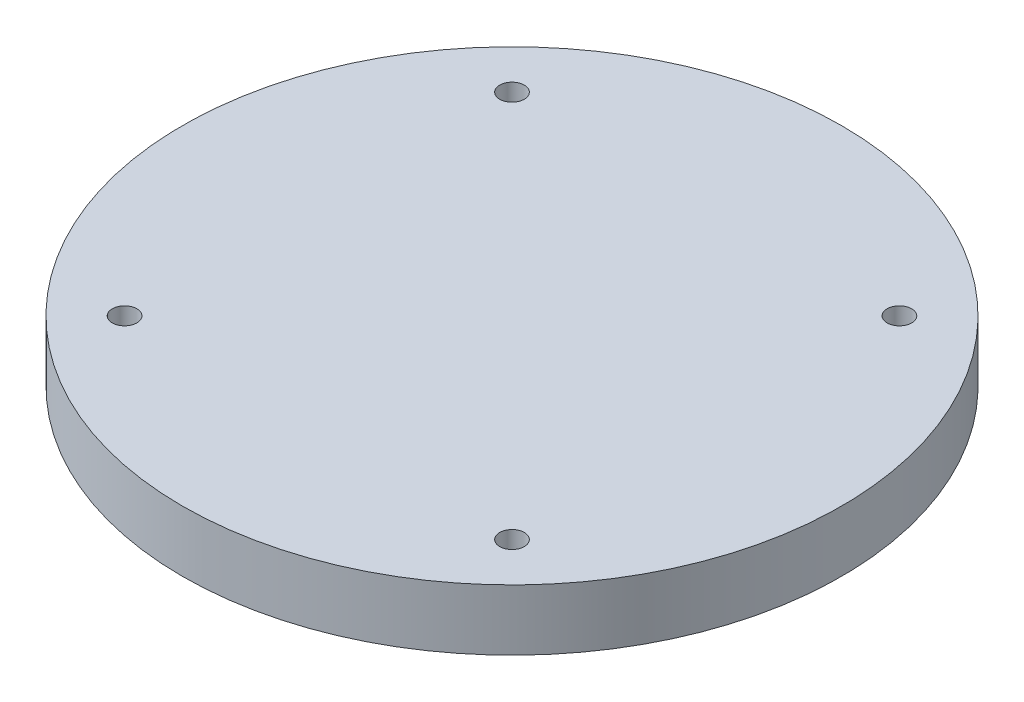
ISO-10303-21;
HEADER;
FILE_DESCRIPTION(('STEP AP214'),'2;1');
FILE_NAME('part.step','',(''),(''),'','','');
FILE_SCHEMA(('AUTOMOTIVE_DESIGN { 1 0 10303 214 1 1 1 1 }'));
ENDSEC;
DATA;
#1=APPLICATION_CONTEXT('core data for automotive mechanical design processes');
#2=APPLICATION_PROTOCOL_DEFINITION('international standard','automotive_design',2000,#1);
#3=PRODUCT_CONTEXT('',#1,'mechanical');
#4=PRODUCT('Part','Part','',(#3));
#5=PRODUCT_RELATED_PRODUCT_CATEGORY('part','',(#4));
#6=PRODUCT_DEFINITION_FORMATION('','',#4);
#7=PRODUCT_DEFINITION_CONTEXT('part definition',#1,'design');
#8=PRODUCT_DEFINITION('design','',#6,#7);
#9=PRODUCT_DEFINITION_SHAPE('','',#8);
#10=(LENGTH_UNIT() NAMED_UNIT(*) SI_UNIT(.MILLI.,.METRE.));
#11=(NAMED_UNIT(*) PLANE_ANGLE_UNIT() SI_UNIT($,.RADIAN.));
#12=(NAMED_UNIT(*) SI_UNIT($,.STERADIAN.) SOLID_ANGLE_UNIT());
#13=UNCERTAINTY_MEASURE_WITH_UNIT(LENGTH_MEASURE(1.E-05),#10,'distance_accuracy_value','');
#14=(GEOMETRIC_REPRESENTATION_CONTEXT(3) GLOBAL_UNCERTAINTY_ASSIGNED_CONTEXT((#13)) GLOBAL_UNIT_ASSIGNED_CONTEXT((#10,
#11,#12)) REPRESENTATION_CONTEXT('',''));
#15=CARTESIAN_POINT('',(0.,0.,0.));
#16=DIRECTION('',(0.,0.,1.));
#17=DIRECTION('',(1.,0.,0.));
#18=AXIS2_PLACEMENT_3D('',#15,#16,#17);
#19=CARTESIAN_POINT('',(0.,5.08,0.));
#20=DIRECTION('',(0.,-1.,0.));
#21=DIRECTION('',(0.,0.,-1.));
#22=AXIS2_PLACEMENT_3D('',#19,#20,#21);
#23=CYLINDRICAL_SURFACE('',#22,27.5);
#24=CARTESIAN_POINT('',(0.,5.08,0.));
#25=DIRECTION('',(0.,1.,0.));
#26=DIRECTION('',(0.,0.,1.));
#27=AXIS2_PLACEMENT_3D('',#24,#25,#26);
#28=CIRCLE('',#27,27.5);
#29=CARTESIAN_POINT('',(0.,5.08,27.5));
#30=VERTEX_POINT('',#29);
#31=EDGE_CURVE('E10',#30,#30,#28,.T.);
#32=ORIENTED_EDGE('',*,*,#31,.F.);
#33=EDGE_LOOP('',(#32));
#34=FACE_BOUND('',#33,.T.);
#35=CARTESIAN_POINT('',(0.,0.,0.));
#36=DIRECTION('',(0.,1.,0.));
#37=DIRECTION('',(0.,0.,1.));
#38=AXIS2_PLACEMENT_3D('',#35,#36,#37);
#39=CIRCLE('',#38,27.5);
#40=CARTESIAN_POINT('',(0.,0.,27.5));
#41=VERTEX_POINT('',#40);
#42=EDGE_CURVE('E34',#41,#41,#39,.T.);
#43=ORIENTED_EDGE('',*,*,#42,.T.);
#44=EDGE_LOOP('',(#43));
#45=FACE_BOUND('',#44,.T.);
#46=ADVANCED_FACE('F31',(#34,#45),#23,.T.);
#47=CARTESIAN_POINT('',(0.,5.08,0.));
#48=DIRECTION('',(0.,1.,0.));
#49=DIRECTION('',(0.,0.,1.));
#50=AXIS2_PLACEMENT_3D('',#47,#48,#49);
#51=PLANE('',#50);
#52=CARTESIAN_POINT('',(16.1644610179254,5.08,16.1644610179245));
#53=DIRECTION('',(0.,1.,0.));
#54=DIRECTION('',(0.,0.,1.));
#55=AXIS2_PLACEMENT_3D('',#52,#53,#54);
#56=CIRCLE('',#55,1.02499999999977);
#57=CARTESIAN_POINT('',(16.1644610179254,5.08,17.1894610179242));
#58=VERTEX_POINT('',#57);
#59=EDGE_CURVE('E56',#58,#58,#56,.T.);
#60=ORIENTED_EDGE('',*,*,#59,.F.);
#61=EDGE_LOOP('',(#60));
#62=FACE_BOUND('',#61,.T.);
#63=CARTESIAN_POINT('',(-16.1644610179245,5.08,-16.1644610179236));
#64=DIRECTION('',(0.,1.,0.));
#65=DIRECTION('',(0.,0.,1.));
#66=AXIS2_PLACEMENT_3D('',#63,#64,#65);
#67=CIRCLE('',#66,1.02500000000097);
#68=CARTESIAN_POINT('',(-16.1644610179245,5.08,-15.1394610179226));
#69=VERTEX_POINT('',#68);
#70=EDGE_CURVE('E49',#69,#69,#67,.T.);
#71=ORIENTED_EDGE('',*,*,#70,.F.);
#72=EDGE_LOOP('',(#71));
#73=FACE_BOUND('',#72,.T.);
#74=CARTESIAN_POINT('',(16.1644610179245,5.08,-16.1644610179245));
#75=DIRECTION('',(0.,1.,0.));
#76=DIRECTION('',(0.,0.,1.));
#77=AXIS2_PLACEMENT_3D('',#74,#75,#76);
#78=CIRCLE('',#77,1.025);
#79=CARTESIAN_POINT('',(16.1644610179245,5.08,-15.1394610179245));
#80=VERTEX_POINT('',#79);
#81=EDGE_CURVE('E61',#80,#80,#78,.T.);
#82=ORIENTED_EDGE('',*,*,#81,.F.);
#83=EDGE_LOOP('',(#82));
#84=FACE_BOUND('',#83,.T.);
#85=CARTESIAN_POINT('',(-16.1644610179236,5.08,16.1644610179254));
#86=DIRECTION('',(0.,1.,0.));
#87=DIRECTION('',(0.,0.,1.));
#88=AXIS2_PLACEMENT_3D('',#85,#86,#87);
#89=CIRCLE('',#88,1.02500000000068);
#90=CARTESIAN_POINT('',(-16.1644610179236,5.08,17.1894610179261));
#91=VERTEX_POINT('',#90);
#92=EDGE_CURVE('E43',#91,#91,#89,.T.);
#93=ORIENTED_EDGE('',*,*,#92,.F.);
#94=EDGE_LOOP('',(#93));
#95=FACE_BOUND('',#94,.T.);
#96=ORIENTED_EDGE('',*,*,#31,.T.);
#97=EDGE_LOOP('',(#96));
#98=FACE_BOUND('',#97,.T.);
#99=ADVANCED_FACE('F76',(#62,#73,#84,#95,#98),#51,.T.);
#100=CARTESIAN_POINT('',(0.,0.,0.));
#101=DIRECTION('',(0.,1.,0.));
#102=DIRECTION('',(0.,0.,1.));
#103=AXIS2_PLACEMENT_3D('',#100,#101,#102);
#104=PLANE('',#103);
#105=ORIENTED_EDGE('',*,*,#42,.F.);
#106=EDGE_LOOP('',(#105));
#107=FACE_BOUND('',#106,.T.);
#108=ADVANCED_FACE('F79',(#107),#104,.F.);
#109=CARTESIAN_POINT('',(-16.1644610179236,1.905,16.1644610179254));
#110=DIRECTION('',(0.,1.,0.));
#111=DIRECTION('',(0.,0.,1.));
#112=AXIS2_PLACEMENT_3D('',#109,#110,#111);
#113=CYLINDRICAL_SURFACE('',#112,1.02500000000068);
#114=CARTESIAN_POINT('',(-16.1644610179236,1.905,16.1644610179254));
#115=DIRECTION('',(0.,1.,0.));
#116=DIRECTION('',(0.,0.,1.));
#117=AXIS2_PLACEMENT_3D('',#114,#115,#116);
#118=CIRCLE('',#117,1.02500000000068);
#119=CARTESIAN_POINT('',(-16.1644610179236,1.905,17.1894610179261));
#120=VERTEX_POINT('',#119);
#121=EDGE_CURVE('E41',#120,#120,#118,.T.);
#122=ORIENTED_EDGE('',*,*,#121,.F.);
#123=EDGE_LOOP('',(#122));
#124=FACE_BOUND('',#123,.T.);
#125=ORIENTED_EDGE('',*,*,#92,.T.);
#126=EDGE_LOOP('',(#125));
#127=FACE_BOUND('',#126,.T.);
#128=ADVANCED_FACE('F84',(#124,#127),#113,.F.);
#129=CARTESIAN_POINT('',(0.,1.905,0.));
#130=DIRECTION('',(0.,1.,0.));
#131=DIRECTION('',(0.,0.,1.));
#132=AXIS2_PLACEMENT_3D('',#129,#130,#131);
#133=PLANE('',#132);
#134=ORIENTED_EDGE('',*,*,#121,.T.);
#135=EDGE_LOOP('',(#134));
#136=FACE_BOUND('',#135,.T.);
#137=ADVANCED_FACE('F72',(#136),#133,.T.);
#138=CARTESIAN_POINT('',(16.1644610179245,1.905,-16.1644610179245));
#139=DIRECTION('',(0.,1.,0.));
#140=DIRECTION('',(0.,0.,1.));
#141=AXIS2_PLACEMENT_3D('',#138,#139,#140);
#142=CYLINDRICAL_SURFACE('',#141,1.025);
#143=CARTESIAN_POINT('',(16.1644610179245,1.905,-16.1644610179245));
#144=DIRECTION('',(0.,1.,0.));
#145=DIRECTION('',(0.,0.,1.));
#146=AXIS2_PLACEMENT_3D('',#143,#144,#145);
#147=CIRCLE('',#146,1.025);
#148=CARTESIAN_POINT('',(16.1644610179245,1.905,-15.1394610179245));
#149=VERTEX_POINT('',#148);
#150=EDGE_CURVE('E53',#149,#149,#147,.T.);
#151=ORIENTED_EDGE('',*,*,#150,.F.);
#152=EDGE_LOOP('',(#151));
#153=FACE_BOUND('',#152,.T.);
#154=ORIENTED_EDGE('',*,*,#81,.T.);
#155=EDGE_LOOP('',(#154));
#156=FACE_BOUND('',#155,.T.);
#157=ADVANCED_FACE('F69',(#153,#156),#142,.F.);
#158=CARTESIAN_POINT('',(0.,1.905,0.));
#159=DIRECTION('',(0.,1.,0.));
#160=DIRECTION('',(0.,0.,1.));
#161=AXIS2_PLACEMENT_3D('',#158,#159,#160);
#162=PLANE('',#161);
#163=ORIENTED_EDGE('',*,*,#150,.T.);
#164=EDGE_LOOP('',(#163));
#165=FACE_BOUND('',#164,.T.);
#166=ADVANCED_FACE('F67',(#165),#162,.T.);
#167=CARTESIAN_POINT('',(-16.1644610179245,1.905,-16.1644610179236));
#168=DIRECTION('',(0.,1.,0.));
#169=DIRECTION('',(0.,0.,1.));
#170=AXIS2_PLACEMENT_3D('',#167,#168,#169);
#171=CYLINDRICAL_SURFACE('',#170,1.02500000000097);
#172=CARTESIAN_POINT('',(-16.1644610179245,1.905,-16.1644610179236));
#173=DIRECTION('',(0.,1.,0.));
#174=DIRECTION('',(0.,0.,1.));
#175=AXIS2_PLACEMENT_3D('',#172,#173,#174);
#176=CIRCLE('',#175,1.02500000000097);
#177=CARTESIAN_POINT('',(-16.1644610179245,1.905,-15.1394610179226));
#178=VERTEX_POINT('',#177);
#179=EDGE_CURVE('E52',#178,#178,#176,.T.);
#180=ORIENTED_EDGE('',*,*,#179,.F.);
#181=EDGE_LOOP('',(#180));
#182=FACE_BOUND('',#181,.T.);
#183=ORIENTED_EDGE('',*,*,#70,.T.);
#184=EDGE_LOOP('',(#183));
#185=FACE_BOUND('',#184,.T.);
#186=ADVANCED_FACE('F136',(#182,#185),#171,.F.);
#187=CARTESIAN_POINT('',(0.,1.905,0.));
#188=DIRECTION('',(0.,1.,0.));
#189=DIRECTION('',(0.,0.,1.));
#190=AXIS2_PLACEMENT_3D('',#187,#188,#189);
#191=PLANE('',#190);
#192=ORIENTED_EDGE('',*,*,#179,.T.);
#193=EDGE_LOOP('',(#192));
#194=FACE_BOUND('',#193,.T.);
#195=ADVANCED_FACE('F144',(#194),#191,.T.);
#196=CARTESIAN_POINT('',(16.1644610179254,1.905,16.1644610179245));
#197=DIRECTION('',(0.,1.,0.));
#198=DIRECTION('',(0.,0.,1.));
#199=AXIS2_PLACEMENT_3D('',#196,#197,#198);
#200=CYLINDRICAL_SURFACE('',#199,1.02499999999977);
#201=CARTESIAN_POINT('',(16.1644610179254,1.905,16.1644610179245));
#202=DIRECTION('',(0.,1.,0.));
#203=DIRECTION('',(0.,0.,1.));
#204=AXIS2_PLACEMENT_3D('',#201,#202,#203);
#205=CIRCLE('',#204,1.02499999999977);
#206=CARTESIAN_POINT('',(16.1644610179254,1.905,17.1894610179242));
#207=VERTEX_POINT('',#206);
#208=EDGE_CURVE('E46',#207,#207,#205,.T.);
#209=ORIENTED_EDGE('',*,*,#208,.F.);
#210=EDGE_LOOP('',(#209));
#211=FACE_BOUND('',#210,.T.);
#212=ORIENTED_EDGE('',*,*,#59,.T.);
#213=EDGE_LOOP('',(#212));
#214=FACE_BOUND('',#213,.T.);
#215=ADVANCED_FACE('F153',(#211,#214),#200,.F.);
#216=CARTESIAN_POINT('',(0.,1.905,0.));
#217=DIRECTION('',(0.,1.,0.));
#218=DIRECTION('',(0.,0.,1.));
#219=AXIS2_PLACEMENT_3D('',#216,#217,#218);
#220=PLANE('',#219);
#221=ORIENTED_EDGE('',*,*,#208,.T.);
#222=EDGE_LOOP('',(#221));
#223=FACE_BOUND('',#222,.T.);
#224=ADVANCED_FACE('F162',(#223),#220,.T.);
#225=CLOSED_SHELL('',(#46,#99,#108,#128,#137,#157,#166,#186,#195,#215,#224));
#226=MANIFOLD_SOLID_BREP('B2',#225);
#227=ADVANCED_BREP_SHAPE_REPRESENTATION('',(#18,#226),#14);
#228=SHAPE_DEFINITION_REPRESENTATION(#9,#227);
ENDSEC;
END-ISO-10303-21;
